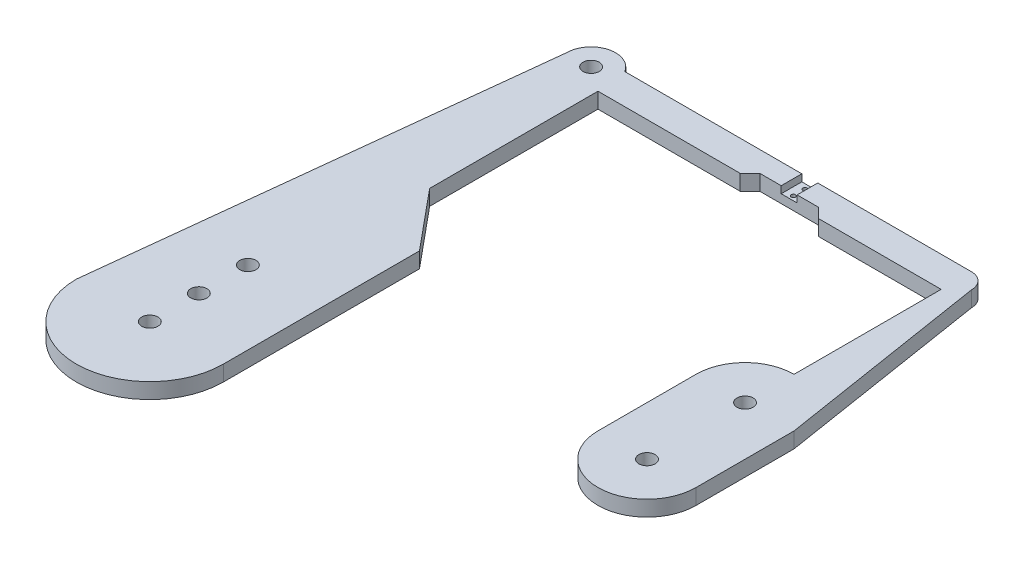
ISO-10303-21;
HEADER;
FILE_DESCRIPTION(('STEP AP214'),'2;1');
FILE_NAME('part.step','',(''),(''),'','','');
FILE_SCHEMA(('AUTOMOTIVE_DESIGN { 1 0 10303 214 1 1 1 1 }'));
ENDSEC;
DATA;
#1=APPLICATION_CONTEXT('core data for automotive mechanical design processes');
#2=APPLICATION_PROTOCOL_DEFINITION('international standard','automotive_design',2000,#1);
#3=PRODUCT_CONTEXT('',#1,'mechanical');
#4=PRODUCT('Part','Part','',(#3));
#5=PRODUCT_RELATED_PRODUCT_CATEGORY('part','',(#4));
#6=PRODUCT_DEFINITION_FORMATION('','',#4);
#7=PRODUCT_DEFINITION_CONTEXT('part definition',#1,'design');
#8=PRODUCT_DEFINITION('design','',#6,#7);
#9=PRODUCT_DEFINITION_SHAPE('','',#8);
#10=(LENGTH_UNIT() NAMED_UNIT(*) SI_UNIT(.MILLI.,.METRE.));
#11=(NAMED_UNIT(*) PLANE_ANGLE_UNIT() SI_UNIT($,.RADIAN.));
#12=(NAMED_UNIT(*) SI_UNIT($,.STERADIAN.) SOLID_ANGLE_UNIT());
#13=UNCERTAINTY_MEASURE_WITH_UNIT(LENGTH_MEASURE(1.E-05),#10,'distance_accuracy_value','');
#14=(GEOMETRIC_REPRESENTATION_CONTEXT(3) GLOBAL_UNCERTAINTY_ASSIGNED_CONTEXT((#13)) GLOBAL_UNIT_ASSIGNED_CONTEXT((#10,
#11,#12)) REPRESENTATION_CONTEXT('',''));
#15=CARTESIAN_POINT('',(0.,0.,0.));
#16=DIRECTION('',(0.,0.,1.));
#17=DIRECTION('',(1.,0.,0.));
#18=AXIS2_PLACEMENT_3D('',#15,#16,#17);
#19=CARTESIAN_POINT('',(0.,6.35,180.));
#20=DIRECTION('',(0.,1.,0.));
#21=DIRECTION('',(0.,0.,1.));
#22=AXIS2_PLACEMENT_3D('',#19,#20,#21);
#23=PLANE('',#22);
#24=DIRECTION('',(0.,0.,-1.));
#25=VECTOR('',#24,1.);
#26=CARTESIAN_POINT('',(87.25,6.35,4.88577018454193));
#27=LINE('',#26,#25);
#28=CARTESIAN_POINT('',(87.25,6.35,3.2));
#29=VERTEX_POINT('',#28);
#30=CARTESIAN_POINT('',(87.25,6.35,-5.21582572254541));
#31=VERTEX_POINT('',#30);
#32=EDGE_CURVE('E326',#29,#31,#27,.T.);
#33=ORIENTED_EDGE('',*,*,#32,.F.);
#34=DIRECTION('',(1.,0.,0.));
#35=VECTOR('',#34,1.);
#36=CARTESIAN_POINT('',(72.,6.35,3.2));
#37=LINE('',#36,#35);
#38=CARTESIAN_POINT('',(96.,6.35,3.2));
#39=VERTEX_POINT('',#38);
#40=EDGE_CURVE('E387',#29,#39,#37,.T.);
#41=ORIENTED_EDGE('',*,*,#40,.T.);
#42=DIRECTION('',(0.707106781186554,0.,0.707106781186541));
#43=VECTOR('',#42,1.);
#44=CARTESIAN_POINT('',(96.,6.35,3.2));
#45=LINE('',#44,#43);
#46=CARTESIAN_POINT('',(100.,6.35,7.2));
#47=VERTEX_POINT('',#46);
#48=EDGE_CURVE('E389',#39,#47,#45,.T.);
#49=ORIENTED_EDGE('',*,*,#48,.T.);
#50=DIRECTION('',(1.,0.,0.));
#51=VECTOR('',#50,1.);
#52=CARTESIAN_POINT('',(100.,6.35,7.2));
#53=LINE('',#52,#51);
#54=CARTESIAN_POINT('',(150.,6.35,7.2));
#55=VERTEX_POINT('',#54);
#56=EDGE_CURVE('E391',#47,#55,#53,.T.);
#57=ORIENTED_EDGE('',*,*,#56,.T.);
#58=DIRECTION('',(0.,0.,1.));
#59=VECTOR('',#58,1.);
#60=CARTESIAN_POINT('',(150.,6.35,7.2));
#61=LINE('',#60,#59);
#62=CARTESIAN_POINT('',(150.,6.35,67.2));
#63=VERTEX_POINT('',#62);
#64=EDGE_CURVE('E393',#55,#63,#61,.T.);
#65=ORIENTED_EDGE('',*,*,#64,.T.);
#66=CARTESIAN_POINT('',(150.,6.35,87.2));
#67=DIRECTION('',(0.,1.,0.));
#68=DIRECTION('',(0.,0.,1.));
#69=AXIS2_PLACEMENT_3D('',#66,#67,#68);
#70=CIRCLE('',#69,20.);
#71=CARTESIAN_POINT('',(130.,6.35,87.2000000000001));
#72=VERTEX_POINT('',#71);
#73=EDGE_CURVE('E395',#63,#72,#70,.T.);
#74=ORIENTED_EDGE('',*,*,#73,.T.);
#75=DIRECTION('',(0.,0.,1.));
#76=VECTOR('',#75,1.);
#77=CARTESIAN_POINT('',(130.,6.35,87.2000000000001));
#78=LINE('',#77,#76);
#79=CARTESIAN_POINT('',(130.,6.35,127.2));
#80=VERTEX_POINT('',#79);
#81=EDGE_CURVE('E397',#72,#80,#78,.T.);
#82=ORIENTED_EDGE('',*,*,#81,.T.);
#83=CARTESIAN_POINT('',(150.,6.35,127.2));
#84=DIRECTION('',(0.,1.,0.));
#85=DIRECTION('',(0.,0.,1.));
#86=AXIS2_PLACEMENT_3D('',#83,#84,#85);
#87=CIRCLE('',#86,20.);
#88=CARTESIAN_POINT('',(170.,6.35,127.2));
#89=VERTEX_POINT('',#88);
#90=EDGE_CURVE('E399',#80,#89,#87,.T.);
#91=ORIENTED_EDGE('',*,*,#90,.T.);
#92=DIRECTION('',(0.,0.,-1.));
#93=VECTOR('',#92,1.);
#94=CARTESIAN_POINT('',(170.,6.35,87.2));
#95=LINE('',#94,#93);
#96=CARTESIAN_POINT('',(170.,6.35,87.2));
#97=VERTEX_POINT('',#96);
#98=EDGE_CURVE('E401',#89,#97,#95,.T.);
#99=ORIENTED_EDGE('',*,*,#98,.T.);
#100=DIRECTION('',(-0.156700683439324,0.,-0.987646138963571));
#101=VECTOR('',#100,1.);
#102=CARTESIAN_POINT('',(156.343737357121,6.35,1.12791163457557));
#103=LINE('',#102,#101);
#104=CARTESIAN_POINT('',(156.343737357121,6.35,1.12791163457557));
#105=VERTEX_POINT('',#104);
#106=EDGE_CURVE('E403',#97,#105,#103,.T.);
#107=ORIENTED_EDGE('',*,*,#106,.T.);
#108=CARTESIAN_POINT('',(150.,6.35,1.12791163457557));
#109=DIRECTION('',(0.,1.,0.));
#110=DIRECTION('',(0.,0.,1.));
#111=AXIS2_PLACEMENT_3D('',#108,#109,#110);
#112=CIRCLE('',#111,6.34373735712099);
#113=CARTESIAN_POINT('',(150.,6.35,-5.21582572254542));
#114=VERTEX_POINT('',#113);
#115=EDGE_CURVE('E405',#105,#114,#112,.T.);
#116=ORIENTED_EDGE('',*,*,#115,.T.);
#117=DIRECTION('',(-1.,0.,0.));
#118=VECTOR('',#117,1.);
#119=CARTESIAN_POINT('',(75.,6.35,-5.21582572254541));
#120=LINE('',#119,#118);
#121=EDGE_CURVE('E407',#114,#31,#120,.T.);
#122=ORIENTED_EDGE('',*,*,#121,.T.);
#123=EDGE_LOOP('',(#33,#41,#49,#57,#65,#74,#82,#91,#99,#107,#116,#122));
#124=FACE_BOUND('',#123,.T.);
#125=CARTESIAN_POINT('',(150.,6.35,87.2));
#126=DIRECTION('',(0.,1.,0.));
#127=DIRECTION('',(0.,0.,1.));
#128=AXIS2_PLACEMENT_3D('',#125,#126,#127);
#129=CIRCLE('',#128,3.3);
#130=CARTESIAN_POINT('',(150.,6.35,90.5));
#131=VERTEX_POINT('',#130);
#132=EDGE_CURVE('E362',#131,#131,#129,.T.);
#133=ORIENTED_EDGE('',*,*,#132,.F.);
#134=EDGE_LOOP('',(#133));
#135=FACE_BOUND('',#134,.T.);
#136=CARTESIAN_POINT('',(150.,6.35,127.2));
#137=DIRECTION('',(0.,1.,0.));
#138=DIRECTION('',(0.,0.,1.));
#139=AXIS2_PLACEMENT_3D('',#136,#137,#138);
#140=CIRCLE('',#139,3.3);
#141=CARTESIAN_POINT('',(150.,6.35,130.5));
#142=VERTEX_POINT('',#141);
#143=EDGE_CURVE('E374',#142,#142,#140,.T.);
#144=ORIENTED_EDGE('',*,*,#143,.F.);
#145=EDGE_LOOP('',(#144));
#146=FACE_BOUND('',#145,.T.);
#147=ADVANCED_FACE('F33',(#124,#135,#146),#23,.T.);
#148=CARTESIAN_POINT('',(84.,6.35,1.50000000000001));
#149=DIRECTION('',(0.,-1.,0.));
#150=DIRECTION('',(0.,0.,-1.));
#151=AXIS2_PLACEMENT_3D('',#148,#149,#150);
#152=CYLINDRICAL_SURFACE('',#151,0.889000000000003);
#153=CARTESIAN_POINT('',(84.,0.,1.50000000000001));
#154=DIRECTION('',(0.,1.,0.));
#155=DIRECTION('',(0.,0.,1.));
#156=AXIS2_PLACEMENT_3D('',#153,#154,#155);
#157=CIRCLE('',#156,0.889000000000003);
#158=CARTESIAN_POINT('',(84.,0.,2.38900000000001));
#159=VERTEX_POINT('',#158);
#160=EDGE_CURVE('E358',#159,#159,#157,.T.);
#161=ORIENTED_EDGE('',*,*,#160,.F.);
#162=EDGE_LOOP('',(#161));
#163=FACE_BOUND('',#162,.T.);
#164=CARTESIAN_POINT('',(84.,3.5,1.50000000000001));
#165=DIRECTION('',(0.,1.,0.));
#166=DIRECTION('',(0.,0.,1.));
#167=AXIS2_PLACEMENT_3D('',#164,#165,#166);
#168=CIRCLE('',#167,0.889000000000003);
#169=CARTESIAN_POINT('',(84.,3.5,2.38900000000001));
#170=VERTEX_POINT('',#169);
#171=EDGE_CURVE('E299',#170,#170,#168,.T.);
#172=ORIENTED_EDGE('',*,*,#171,.T.);
#173=EDGE_LOOP('',(#172));
#174=FACE_BOUND('',#173,.T.);
#175=ADVANCED_FACE('F473',(#163,#174),#152,.F.);
#176=CARTESIAN_POINT('',(84.,6.35,-3.21599999999999));
#177=DIRECTION('',(0.,-1.,0.));
#178=DIRECTION('',(0.,0.,-1.));
#179=AXIS2_PLACEMENT_3D('',#176,#177,#178);
#180=CYLINDRICAL_SURFACE('',#179,0.889000000000003);
#181=CARTESIAN_POINT('',(84.,0.,-3.21599999999999));
#182=DIRECTION('',(0.,1.,0.));
#183=DIRECTION('',(0.,0.,1.));
#184=AXIS2_PLACEMENT_3D('',#181,#182,#183);
#185=CIRCLE('',#184,0.889000000000003);
#186=CARTESIAN_POINT('',(84.,0.,-2.32699999999999));
#187=VERTEX_POINT('',#186);
#188=EDGE_CURVE('E353',#187,#187,#185,.T.);
#189=ORIENTED_EDGE('',*,*,#188,.F.);
#190=EDGE_LOOP('',(#189));
#191=FACE_BOUND('',#190,.T.);
#192=CARTESIAN_POINT('',(84.,3.5,-3.21599999999999));
#193=DIRECTION('',(0.,1.,0.));
#194=DIRECTION('',(0.,0.,1.));
#195=AXIS2_PLACEMENT_3D('',#192,#193,#194);
#196=CIRCLE('',#195,0.889000000000003);
#197=CARTESIAN_POINT('',(84.,3.5,-2.32699999999999));
#198=VERTEX_POINT('',#197);
#199=EDGE_CURVE('E297',#198,#198,#196,.T.);
#200=ORIENTED_EDGE('',*,*,#199,.T.);
#201=EDGE_LOOP('',(#200));
#202=FACE_BOUND('',#201,.T.);
#203=ADVANCED_FACE('F478',(#191,#202),#180,.F.);
#204=DIRECTION('',(0.,0.,1.));
#205=VECTOR('',#204,1.);
#206=CARTESIAN_POINT('',(80.75,6.35,-5.83824904864392));
#207=LINE('',#206,#205);
#208=CARTESIAN_POINT('',(80.75,6.35,-5.21582572254541));
#209=VERTEX_POINT('',#208);
#210=CARTESIAN_POINT('',(80.75,6.35,3.2));
#211=VERTEX_POINT('',#210);
#212=EDGE_CURVE('E318',#209,#211,#207,.T.);
#213=ORIENTED_EDGE('',*,*,#212,.F.);
#214=CARTESIAN_POINT('',(8.53200808907456,6.35,-5.2158257225454));
#215=VERTEX_POINT('',#214);
#216=EDGE_CURVE('E310',#209,#215,#120,.T.);
#217=ORIENTED_EDGE('',*,*,#216,.T.);
#218=CARTESIAN_POINT('',(0.,6.35,0.));
#219=DIRECTION('',(0.,1.,0.));
#220=DIRECTION('',(0.,0.,1.));
#221=AXIS2_PLACEMENT_3D('',#218,#219,#220);
#222=CIRCLE('',#221,10.);
#223=CARTESIAN_POINT('',(-10.,6.35,0.));
#224=VERTEX_POINT('',#223);
#225=EDGE_CURVE('E410',#215,#224,#222,.T.);
#226=ORIENTED_EDGE('',*,*,#225,.T.);
#227=DIRECTION('',(-0.110431526074846,0.,0.993883734673619));
#228=VECTOR('',#227,1.);
#229=CARTESIAN_POINT('',(-10.,6.35,0.));
#230=LINE('',#229,#228);
#231=CARTESIAN_POINT('',(-30.,6.35,180.));
#232=VERTEX_POINT('',#231);
#233=EDGE_CURVE('E412',#224,#232,#230,.T.);
#234=ORIENTED_EDGE('',*,*,#233,.T.);
#235=CARTESIAN_POINT('',(0.,6.35,180.));
#236=DIRECTION('',(0.,1.,0.));
#237=DIRECTION('',(0.,0.,1.));
#238=AXIS2_PLACEMENT_3D('',#235,#236,#237);
#239=CIRCLE('',#238,30.);
#240=CARTESIAN_POINT('',(30.,6.35,180.));
#241=VERTEX_POINT('',#240);
#242=EDGE_CURVE('E187',#232,#241,#239,.T.);
#243=ORIENTED_EDGE('',*,*,#242,.T.);
#244=DIRECTION('',(0.,0.,-1.));
#245=VECTOR('',#244,1.);
#246=CARTESIAN_POINT('',(30.,6.35,180.));
#247=LINE('',#246,#245);
#248=CARTESIAN_POINT('',(30.,6.35,100.));
#249=VERTEX_POINT('',#248);
#250=EDGE_CURVE('E178',#241,#249,#247,.T.);
#251=ORIENTED_EDGE('',*,*,#250,.T.);
#252=DIRECTION('',(-0.637951972751051,0.,-0.770076152379128));
#253=VECTOR('',#252,1.);
#254=CARTESIAN_POINT('',(30.,6.35,100.));
#255=LINE('',#254,#253);
#256=CARTESIAN_POINT('',(10.,6.35,75.857864376269));
#257=VERTEX_POINT('',#256);
#258=EDGE_CURVE('E184',#249,#257,#255,.T.);
#259=ORIENTED_EDGE('',*,*,#258,.T.);
#260=DIRECTION('',(0.,0.,-1.));
#261=VECTOR('',#260,1.);
#262=CARTESIAN_POINT('',(10.,6.35,7.2));
#263=LINE('',#262,#261);
#264=CARTESIAN_POINT('',(10.,6.35,7.2));
#265=VERTEX_POINT('',#264);
#266=EDGE_CURVE('E57',#257,#265,#263,.T.);
#267=ORIENTED_EDGE('',*,*,#266,.T.);
#268=DIRECTION('',(1.,0.,0.));
#269=VECTOR('',#268,1.);
#270=CARTESIAN_POINT('',(59.,6.35,7.2));
#271=LINE('',#270,#269);
#272=CARTESIAN_POINT('',(68.0000000000001,6.35,7.2));
#273=VERTEX_POINT('',#272);
#274=EDGE_CURVE('E129',#265,#273,#271,.T.);
#275=ORIENTED_EDGE('',*,*,#274,.T.);
#276=DIRECTION('',(0.707106781186541,0.,-0.707106781186554));
#277=VECTOR('',#276,1.);
#278=CARTESIAN_POINT('',(72.,6.35,3.2));
#279=LINE('',#278,#277);
#280=CARTESIAN_POINT('',(72.,6.35,3.2));
#281=VERTEX_POINT('',#280);
#282=EDGE_CURVE('E385',#273,#281,#279,.T.);
#283=ORIENTED_EDGE('',*,*,#282,.T.);
#284=EDGE_CURVE('E325',#281,#211,#37,.T.);
#285=ORIENTED_EDGE('',*,*,#284,.T.);
#286=EDGE_LOOP('',(#213,#217,#226,#234,#243,#251,#259,#267,#275,#283,#285));
#287=FACE_BOUND('',#286,.T.);
#288=CARTESIAN_POINT('',(0.,6.35,160.));
#289=DIRECTION('',(0.,1.,0.));
#290=DIRECTION('',(0.,0.,1.));
#291=AXIS2_PLACEMENT_3D('',#288,#289,#290);
#292=CIRCLE('',#291,3.3);
#293=CARTESIAN_POINT('',(0.,6.35,163.3));
#294=VERTEX_POINT('',#293);
#295=EDGE_CURVE('E350',#294,#294,#292,.T.);
#296=ORIENTED_EDGE('',*,*,#295,.F.);
#297=EDGE_LOOP('',(#296));
#298=FACE_BOUND('',#297,.T.);
#299=CARTESIAN_POINT('',(0.,6.35,180.));
#300=DIRECTION('',(0.,1.,0.));
#301=DIRECTION('',(0.,0.,1.));
#302=AXIS2_PLACEMENT_3D('',#299,#300,#301);
#303=CIRCLE('',#302,3.3);
#304=CARTESIAN_POINT('',(0.,6.35,183.3));
#305=VERTEX_POINT('',#304);
#306=EDGE_CURVE('E368',#305,#305,#303,.T.);
#307=ORIENTED_EDGE('',*,*,#306,.F.);
#308=EDGE_LOOP('',(#307));
#309=FACE_BOUND('',#308,.T.);
#310=CARTESIAN_POINT('',(0.,6.35,0.));
#311=DIRECTION('',(0.,1.,0.));
#312=DIRECTION('',(0.,0.,1.));
#313=AXIS2_PLACEMENT_3D('',#310,#311,#312);
#314=CIRCLE('',#313,3.3);
#315=CARTESIAN_POINT('',(0.,6.35,3.3));
#316=VERTEX_POINT('',#315);
#317=EDGE_CURVE('E211',#316,#316,#314,.T.);
#318=ORIENTED_EDGE('',*,*,#317,.F.);
#319=EDGE_LOOP('',(#318));
#320=FACE_BOUND('',#319,.T.);
#321=CARTESIAN_POINT('',(0.,6.35,140.));
#322=DIRECTION('',(0.,1.,0.));
#323=DIRECTION('',(0.,0.,1.));
#324=AXIS2_PLACEMENT_3D('',#321,#322,#323);
#325=CIRCLE('',#324,3.3);
#326=CARTESIAN_POINT('',(0.,6.35,143.3));
#327=VERTEX_POINT('',#326);
#328=EDGE_CURVE('E344',#327,#327,#325,.T.);
#329=ORIENTED_EDGE('',*,*,#328,.F.);
#330=EDGE_LOOP('',(#329));
#331=FACE_BOUND('',#330,.T.);
#332=ADVANCED_FACE('F181',(#287,#298,#309,#320,#331),#23,.T.);
#333=CARTESIAN_POINT('',(0.,0.,180.));
#334=DIRECTION('',(0.,1.,0.));
#335=DIRECTION('',(0.,0.,1.));
#336=AXIS2_PLACEMENT_3D('',#333,#334,#335);
#337=PLANE('',#336);
#338=DIRECTION('',(1.,0.,0.));
#339=VECTOR('',#338,1.);
#340=CARTESIAN_POINT('',(68.0000000000001,0.,7.2));
#341=LINE('',#340,#339);
#342=CARTESIAN_POINT('',(10.,0.,7.2));
#343=VERTEX_POINT('',#342);
#344=CARTESIAN_POINT('',(68.0000000000001,0.,7.2));
#345=VERTEX_POINT('',#344);
#346=EDGE_CURVE('E123',#343,#345,#341,.T.);
#347=ORIENTED_EDGE('',*,*,#346,.F.);
#348=DIRECTION('',(0.,0.,-1.));
#349=VECTOR('',#348,1.);
#350=CARTESIAN_POINT('',(10.,0.,7.2));
#351=LINE('',#350,#349);
#352=CARTESIAN_POINT('',(10.,0.,75.857864376269));
#353=VERTEX_POINT('',#352);
#354=EDGE_CURVE('E246',#353,#343,#351,.T.);
#355=ORIENTED_EDGE('',*,*,#354,.F.);
#356=DIRECTION('',(-0.637951972751051,0.,-0.770076152379128));
#357=VECTOR('',#356,1.);
#358=CARTESIAN_POINT('',(30.,0.,100.));
#359=LINE('',#358,#357);
#360=CARTESIAN_POINT('',(30.,0.,100.));
#361=VERTEX_POINT('',#360);
#362=EDGE_CURVE('E244',#361,#353,#359,.T.);
#363=ORIENTED_EDGE('',*,*,#362,.F.);
#364=DIRECTION('',(0.,0.,-1.));
#365=VECTOR('',#364,1.);
#366=CARTESIAN_POINT('',(30.,0.,180.));
#367=LINE('',#366,#365);
#368=CARTESIAN_POINT('',(30.,0.,180.));
#369=VERTEX_POINT('',#368);
#370=EDGE_CURVE('E196',#369,#361,#367,.T.);
#371=ORIENTED_EDGE('',*,*,#370,.F.);
#372=CARTESIAN_POINT('',(0.,0.,180.));
#373=DIRECTION('',(0.,1.,0.));
#374=DIRECTION('',(0.,0.,1.));
#375=AXIS2_PLACEMENT_3D('',#372,#373,#374);
#376=CIRCLE('',#375,30.);
#377=CARTESIAN_POINT('',(-30.,0.,180.));
#378=VERTEX_POINT('',#377);
#379=EDGE_CURVE('E241',#378,#369,#376,.T.);
#380=ORIENTED_EDGE('',*,*,#379,.F.);
#381=DIRECTION('',(-0.110431526074846,0.,0.993883734673619));
#382=VECTOR('',#381,1.);
#383=CARTESIAN_POINT('',(-10.,0.,0.));
#384=LINE('',#383,#382);
#385=CARTESIAN_POINT('',(-10.,0.,0.));
#386=VERTEX_POINT('',#385);
#387=EDGE_CURVE('E239',#386,#378,#384,.T.);
#388=ORIENTED_EDGE('',*,*,#387,.F.);
#389=CARTESIAN_POINT('',(0.,0.,0.));
#390=DIRECTION('',(0.,1.,0.));
#391=DIRECTION('',(0.,0.,1.));
#392=AXIS2_PLACEMENT_3D('',#389,#390,#391);
#393=CIRCLE('',#392,10.);
#394=CARTESIAN_POINT('',(8.53200808907456,0.,-5.2158257225454));
#395=VERTEX_POINT('',#394);
#396=EDGE_CURVE('E237',#395,#386,#393,.T.);
#397=ORIENTED_EDGE('',*,*,#396,.F.);
#398=DIRECTION('',(-1.,0.,0.));
#399=VECTOR('',#398,1.);
#400=CARTESIAN_POINT('',(75.,0.,-5.21582572254541));
#401=LINE('',#400,#399);
#402=CARTESIAN_POINT('',(150.,0.,-5.21582572254542));
#403=VERTEX_POINT('',#402);
#404=EDGE_CURVE('E235',#403,#395,#401,.T.);
#405=ORIENTED_EDGE('',*,*,#404,.F.);
#406=CARTESIAN_POINT('',(150.,0.,1.12791163457557));
#407=DIRECTION('',(0.,1.,0.));
#408=DIRECTION('',(0.,0.,1.));
#409=AXIS2_PLACEMENT_3D('',#406,#407,#408);
#410=CIRCLE('',#409,6.34373735712099);
#411=CARTESIAN_POINT('',(156.343737357121,0.,1.12791163457557));
#412=VERTEX_POINT('',#411);
#413=EDGE_CURVE('E232',#412,#403,#410,.T.);
#414=ORIENTED_EDGE('',*,*,#413,.F.);
#415=DIRECTION('',(-0.156700683439324,0.,-0.987646138963571));
#416=VECTOR('',#415,1.);
#417=CARTESIAN_POINT('',(156.343737357121,0.,1.12791163457557));
#418=LINE('',#417,#416);
#419=CARTESIAN_POINT('',(170.,0.,87.2));
#420=VERTEX_POINT('',#419);
#421=EDGE_CURVE('E230',#420,#412,#418,.T.);
#422=ORIENTED_EDGE('',*,*,#421,.F.);
#423=DIRECTION('',(0.,0.,-1.));
#424=VECTOR('',#423,1.);
#425=CARTESIAN_POINT('',(170.,0.,87.2));
#426=LINE('',#425,#424);
#427=CARTESIAN_POINT('',(170.,0.,127.2));
#428=VERTEX_POINT('',#427);
#429=EDGE_CURVE('E228',#428,#420,#426,.T.);
#430=ORIENTED_EDGE('',*,*,#429,.F.);
#431=CARTESIAN_POINT('',(150.,0.,127.2));
#432=DIRECTION('',(0.,1.,0.));
#433=DIRECTION('',(0.,0.,1.));
#434=AXIS2_PLACEMENT_3D('',#431,#432,#433);
#435=CIRCLE('',#434,20.);
#436=CARTESIAN_POINT('',(130.,0.,127.2));
#437=VERTEX_POINT('',#436);
#438=EDGE_CURVE('E226',#437,#428,#435,.T.);
#439=ORIENTED_EDGE('',*,*,#438,.F.);
#440=DIRECTION('',(0.,0.,1.));
#441=VECTOR('',#440,1.);
#442=CARTESIAN_POINT('',(130.,0.,87.2000000000001));
#443=LINE('',#442,#441);
#444=CARTESIAN_POINT('',(130.,0.,87.2000000000001));
#445=VERTEX_POINT('',#444);
#446=EDGE_CURVE('E224',#445,#437,#443,.T.);
#447=ORIENTED_EDGE('',*,*,#446,.F.);
#448=CARTESIAN_POINT('',(150.,0.,87.2));
#449=DIRECTION('',(0.,1.,0.));
#450=DIRECTION('',(0.,0.,1.));
#451=AXIS2_PLACEMENT_3D('',#448,#449,#450);
#452=CIRCLE('',#451,20.);
#453=CARTESIAN_POINT('',(150.,0.,67.2));
#454=VERTEX_POINT('',#453);
#455=EDGE_CURVE('E222',#454,#445,#452,.T.);
#456=ORIENTED_EDGE('',*,*,#455,.F.);
#457=DIRECTION('',(0.,0.,1.));
#458=VECTOR('',#457,1.);
#459=CARTESIAN_POINT('',(150.,0.,7.2));
#460=LINE('',#459,#458);
#461=CARTESIAN_POINT('',(150.,0.,7.2));
#462=VERTEX_POINT('',#461);
#463=EDGE_CURVE('E220',#462,#454,#460,.T.);
#464=ORIENTED_EDGE('',*,*,#463,.F.);
#465=DIRECTION('',(1.,0.,0.));
#466=VECTOR('',#465,1.);
#467=CARTESIAN_POINT('',(100.,0.,7.2));
#468=LINE('',#467,#466);
#469=CARTESIAN_POINT('',(100.,0.,7.2));
#470=VERTEX_POINT('',#469);
#471=EDGE_CURVE('E218',#470,#462,#468,.T.);
#472=ORIENTED_EDGE('',*,*,#471,.F.);
#473=DIRECTION('',(0.707106781186554,0.,0.707106781186541));
#474=VECTOR('',#473,1.);
#475=CARTESIAN_POINT('',(96.,0.,3.2));
#476=LINE('',#475,#474);
#477=CARTESIAN_POINT('',(96.,0.,3.2));
#478=VERTEX_POINT('',#477);
#479=EDGE_CURVE('E216',#478,#470,#476,.T.);
#480=ORIENTED_EDGE('',*,*,#479,.F.);
#481=DIRECTION('',(1.,0.,0.));
#482=VECTOR('',#481,1.);
#483=CARTESIAN_POINT('',(84.,0.,3.2));
#484=LINE('',#483,#482);
#485=CARTESIAN_POINT('',(72.,0.,3.2));
#486=VERTEX_POINT('',#485);
#487=EDGE_CURVE('E214',#486,#478,#484,.T.);
#488=ORIENTED_EDGE('',*,*,#487,.F.);
#489=DIRECTION('',(0.707106781186541,0.,-0.707106781186554));
#490=VECTOR('',#489,1.);
#491=CARTESIAN_POINT('',(72.,0.,3.2));
#492=LINE('',#491,#490);
#493=EDGE_CURVE('E210',#345,#486,#492,.T.);
#494=ORIENTED_EDGE('',*,*,#493,.F.);
#495=EDGE_LOOP('',(#347,#355,#363,#371,#380,#388,#397,#405,#414,#422,#430,#439,#447,#456,#464,
#472,#480,#488,#494));
#496=FACE_BOUND('',#495,.T.);
#497=CARTESIAN_POINT('',(0.,0.,0.));
#498=DIRECTION('',(0.,1.,0.));
#499=DIRECTION('',(0.,0.,1.));
#500=AXIS2_PLACEMENT_3D('',#497,#498,#499);
#501=CIRCLE('',#500,3.3);
#502=CARTESIAN_POINT('',(0.,0.,3.3));
#503=VERTEX_POINT('',#502);
#504=EDGE_CURVE('E377',#503,#503,#501,.T.);
#505=ORIENTED_EDGE('',*,*,#504,.T.);
#506=EDGE_LOOP('',(#505));
#507=FACE_BOUND('',#506,.T.);
#508=CARTESIAN_POINT('',(150.,0.,127.2));
#509=DIRECTION('',(0.,1.,0.));
#510=DIRECTION('',(0.,0.,1.));
#511=AXIS2_PLACEMENT_3D('',#508,#509,#510);
#512=CIRCLE('',#511,3.3);
#513=CARTESIAN_POINT('',(150.,0.,130.5));
#514=VERTEX_POINT('',#513);
#515=EDGE_CURVE('E371',#514,#514,#512,.T.);
#516=ORIENTED_EDGE('',*,*,#515,.T.);
#517=EDGE_LOOP('',(#516));
#518=FACE_BOUND('',#517,.T.);
#519=CARTESIAN_POINT('',(0.,0.,180.));
#520=DIRECTION('',(0.,1.,0.));
#521=DIRECTION('',(0.,0.,1.));
#522=AXIS2_PLACEMENT_3D('',#519,#520,#521);
#523=CIRCLE('',#522,3.3);
#524=CARTESIAN_POINT('',(0.,0.,183.3));
#525=VERTEX_POINT('',#524);
#526=EDGE_CURVE('E365',#525,#525,#523,.T.);
#527=ORIENTED_EDGE('',*,*,#526,.T.);
#528=EDGE_LOOP('',(#527));
#529=FACE_BOUND('',#528,.T.);
#530=CARTESIAN_POINT('',(150.,0.,87.2));
#531=DIRECTION('',(0.,1.,0.));
#532=DIRECTION('',(0.,0.,1.));
#533=AXIS2_PLACEMENT_3D('',#530,#531,#532);
#534=CIRCLE('',#533,3.3);
#535=CARTESIAN_POINT('',(150.,0.,90.5));
#536=VERTEX_POINT('',#535);
#537=EDGE_CURVE('E361',#536,#536,#534,.T.);
#538=ORIENTED_EDGE('',*,*,#537,.T.);
#539=EDGE_LOOP('',(#538));
#540=FACE_BOUND('',#539,.T.);
#541=ORIENTED_EDGE('',*,*,#160,.T.);
#542=EDGE_LOOP('',(#541));
#543=FACE_BOUND('',#542,.T.);
#544=ORIENTED_EDGE('',*,*,#188,.T.);
#545=EDGE_LOOP('',(#544));
#546=FACE_BOUND('',#545,.T.);
#547=CARTESIAN_POINT('',(0.,0.,160.));
#548=DIRECTION('',(0.,1.,0.));
#549=DIRECTION('',(0.,0.,1.));
#550=AXIS2_PLACEMENT_3D('',#547,#548,#549);
#551=CIRCLE('',#550,3.3);
#552=CARTESIAN_POINT('',(0.,0.,163.3));
#553=VERTEX_POINT('',#552);
#554=EDGE_CURVE('E347',#553,#553,#551,.T.);
#555=ORIENTED_EDGE('',*,*,#554,.T.);
#556=EDGE_LOOP('',(#555));
#557=FACE_BOUND('',#556,.T.);
#558=CARTESIAN_POINT('',(0.,0.,140.));
#559=DIRECTION('',(0.,1.,0.));
#560=DIRECTION('',(0.,0.,1.));
#561=AXIS2_PLACEMENT_3D('',#558,#559,#560);
#562=CIRCLE('',#561,3.3);
#563=CARTESIAN_POINT('',(0.,0.,143.3));
#564=VERTEX_POINT('',#563);
#565=EDGE_CURVE('E343',#564,#564,#562,.T.);
#566=ORIENTED_EDGE('',*,*,#565,.T.);
#567=EDGE_LOOP('',(#566));
#568=FACE_BOUND('',#567,.T.);
#569=ADVANCED_FACE('F423',(#496,#507,#518,#529,#540,#543,#546,#557,#568),#337,.F.);
#570=CARTESIAN_POINT('',(68.0000000000001,6.35,7.2));
#571=DIRECTION('',(0.,0.,-1.));
#572=DIRECTION('',(-1.,0.,0.));
#573=AXIS2_PLACEMENT_3D('',#570,#571,#572);
#574=PLANE('',#573);
#575=ORIENTED_EDGE('',*,*,#346,.T.);
#576=DIRECTION('',(0.,-1.,0.));
#577=VECTOR('',#576,1.);
#578=CARTESIAN_POINT('',(68.0000000000001,6.35,7.2));
#579=LINE('',#578,#577);
#580=EDGE_CURVE('E294',#273,#345,#579,.T.);
#581=ORIENTED_EDGE('',*,*,#580,.F.);
#582=ORIENTED_EDGE('',*,*,#274,.F.);
#583=DIRECTION('',(0.,-1.,0.));
#584=VECTOR('',#583,1.);
#585=CARTESIAN_POINT('',(10.,6.35,7.2));
#586=LINE('',#585,#584);
#587=EDGE_CURVE('E205',#265,#343,#586,.T.);
#588=ORIENTED_EDGE('',*,*,#587,.T.);
#589=EDGE_LOOP('',(#575,#581,#582,#588));
#590=FACE_BOUND('',#589,.T.);
#591=ADVANCED_FACE('F35',(#590),#574,.F.);
#592=CARTESIAN_POINT('',(72.,6.35,3.2));
#593=DIRECTION('',(-0.707106781186554,0.,-0.707106781186541));
#594=DIRECTION('',(-0.707106781186541,0.,0.707106781186554));
#595=AXIS2_PLACEMENT_3D('',#592,#593,#594);
#596=PLANE('',#595);
#597=ORIENTED_EDGE('',*,*,#493,.T.);
#598=DIRECTION('',(0.,-1.,0.));
#599=VECTOR('',#598,1.);
#600=CARTESIAN_POINT('',(72.,6.35,3.2));
#601=LINE('',#600,#599);
#602=EDGE_CURVE('E291',#281,#486,#601,.T.);
#603=ORIENTED_EDGE('',*,*,#602,.F.);
#604=ORIENTED_EDGE('',*,*,#282,.F.);
#605=ORIENTED_EDGE('',*,*,#580,.T.);
#606=EDGE_LOOP('',(#597,#603,#604,#605));
#607=FACE_BOUND('',#606,.T.);
#608=ADVANCED_FACE('F431',(#607),#596,.F.);
#609=CARTESIAN_POINT('',(84.,6.35,3.2));
#610=DIRECTION('',(0.,0.,-1.));
#611=DIRECTION('',(-1.,0.,0.));
#612=AXIS2_PLACEMENT_3D('',#609,#610,#611);
#613=PLANE('',#612);
#614=ORIENTED_EDGE('',*,*,#40,.F.);
#615=DIRECTION('',(0.,-1.,0.));
#616=VECTOR('',#615,1.);
#617=CARTESIAN_POINT('',(87.25,6.35,3.2));
#618=LINE('',#617,#616);
#619=CARTESIAN_POINT('',(87.25,3.5,3.2));
#620=VERTEX_POINT('',#619);
#621=EDGE_CURVE('E340',#29,#620,#618,.T.);
#622=ORIENTED_EDGE('',*,*,#621,.T.);
#623=DIRECTION('',(1.,0.,0.));
#624=VECTOR('',#623,1.);
#625=CARTESIAN_POINT('',(84.,3.5,3.2));
#626=LINE('',#625,#624);
#627=CARTESIAN_POINT('',(80.75,3.5,3.2));
#628=VERTEX_POINT('',#627);
#629=EDGE_CURVE('E336',#628,#620,#626,.T.);
#630=ORIENTED_EDGE('',*,*,#629,.F.);
#631=DIRECTION('',(0.,1.,0.));
#632=VECTOR('',#631,1.);
#633=CARTESIAN_POINT('',(80.75,6.35,3.2));
#634=LINE('',#633,#632);
#635=EDGE_CURVE('E338',#628,#211,#634,.T.);
#636=ORIENTED_EDGE('',*,*,#635,.T.);
#637=ORIENTED_EDGE('',*,*,#284,.F.);
#638=ORIENTED_EDGE('',*,*,#602,.T.);
#639=ORIENTED_EDGE('',*,*,#487,.T.);
#640=DIRECTION('',(0.,-1.,0.));
#641=VECTOR('',#640,1.);
#642=CARTESIAN_POINT('',(96.,6.35,3.2));
#643=LINE('',#642,#641);
#644=EDGE_CURVE('E288',#39,#478,#643,.T.);
#645=ORIENTED_EDGE('',*,*,#644,.F.);
#646=EDGE_LOOP('',(#614,#622,#630,#636,#637,#638,#639,#645));
#647=FACE_BOUND('',#646,.T.);
#648=ADVANCED_FACE('F434',(#647),#613,.F.);
#649=CARTESIAN_POINT('',(96.,6.35,3.2));
#650=DIRECTION('',(0.707106781186541,0.,-0.707106781186554));
#651=DIRECTION('',(-0.707106781186554,0.,-0.707106781186541));
#652=AXIS2_PLACEMENT_3D('',#649,#650,#651);
#653=PLANE('',#652);
#654=ORIENTED_EDGE('',*,*,#479,.T.);
#655=DIRECTION('',(0.,-1.,0.));
#656=VECTOR('',#655,1.);
#657=CARTESIAN_POINT('',(100.,6.35,7.2));
#658=LINE('',#657,#656);
#659=EDGE_CURVE('E285',#47,#470,#658,.T.);
#660=ORIENTED_EDGE('',*,*,#659,.F.);
#661=ORIENTED_EDGE('',*,*,#48,.F.);
#662=ORIENTED_EDGE('',*,*,#644,.T.);
#663=EDGE_LOOP('',(#654,#660,#661,#662));
#664=FACE_BOUND('',#663,.T.);
#665=ADVANCED_FACE('F579',(#664),#653,.F.);
#666=CARTESIAN_POINT('',(100.,6.35,7.2));
#667=DIRECTION('',(0.,0.,-1.));
#668=DIRECTION('',(-1.,0.,0.));
#669=AXIS2_PLACEMENT_3D('',#666,#667,#668);
#670=PLANE('',#669);
#671=ORIENTED_EDGE('',*,*,#471,.T.);
#672=DIRECTION('',(0.,-1.,0.));
#673=VECTOR('',#672,1.);
#674=CARTESIAN_POINT('',(150.,6.35,7.2));
#675=LINE('',#674,#673);
#676=EDGE_CURVE('E282',#55,#462,#675,.T.);
#677=ORIENTED_EDGE('',*,*,#676,.F.);
#678=ORIENTED_EDGE('',*,*,#56,.F.);
#679=ORIENTED_EDGE('',*,*,#659,.T.);
#680=EDGE_LOOP('',(#671,#677,#678,#679));
#681=FACE_BOUND('',#680,.T.);
#682=ADVANCED_FACE('F740',(#681),#670,.F.);
#683=CARTESIAN_POINT('',(150.,6.35,7.2));
#684=DIRECTION('',(1.,0.,0.));
#685=DIRECTION('',(0.,0.,-1.));
#686=AXIS2_PLACEMENT_3D('',#683,#684,#685);
#687=PLANE('',#686);
#688=ORIENTED_EDGE('',*,*,#463,.T.);
#689=DIRECTION('',(0.,-1.,0.));
#690=VECTOR('',#689,1.);
#691=CARTESIAN_POINT('',(150.,6.35,67.2));
#692=LINE('',#691,#690);
#693=EDGE_CURVE('E279',#63,#454,#692,.T.);
#694=ORIENTED_EDGE('',*,*,#693,.F.);
#695=ORIENTED_EDGE('',*,*,#64,.F.);
#696=ORIENTED_EDGE('',*,*,#676,.T.);
#697=EDGE_LOOP('',(#688,#694,#695,#696));
#698=FACE_BOUND('',#697,.T.);
#699=ADVANCED_FACE('F730',(#698),#687,.F.);
#700=CARTESIAN_POINT('',(150.,6.35,87.2));
#701=DIRECTION('',(0.,-1.,0.));
#702=DIRECTION('',(0.,0.,-1.));
#703=AXIS2_PLACEMENT_3D('',#700,#701,#702);
#704=CYLINDRICAL_SURFACE('',#703,20.);
#705=ORIENTED_EDGE('',*,*,#455,.T.);
#706=DIRECTION('',(0.,-1.,0.));
#707=VECTOR('',#706,1.);
#708=CARTESIAN_POINT('',(130.,6.35,87.2000000000001));
#709=LINE('',#708,#707);
#710=EDGE_CURVE('E276',#72,#445,#709,.T.);
#711=ORIENTED_EDGE('',*,*,#710,.F.);
#712=ORIENTED_EDGE('',*,*,#73,.F.);
#713=ORIENTED_EDGE('',*,*,#693,.T.);
#714=EDGE_LOOP('',(#705,#711,#712,#713));
#715=FACE_BOUND('',#714,.T.);
#716=ADVANCED_FACE('F720',(#715),#704,.T.);
#717=CARTESIAN_POINT('',(130.,6.35,87.2000000000001));
#718=DIRECTION('',(1.,0.,0.));
#719=DIRECTION('',(0.,0.,-1.));
#720=AXIS2_PLACEMENT_3D('',#717,#718,#719);
#721=PLANE('',#720);
#722=ORIENTED_EDGE('',*,*,#446,.T.);
#723=DIRECTION('',(0.,-1.,0.));
#724=VECTOR('',#723,1.);
#725=CARTESIAN_POINT('',(130.,6.35,127.2));
#726=LINE('',#725,#724);
#727=EDGE_CURVE('E273',#80,#437,#726,.T.);
#728=ORIENTED_EDGE('',*,*,#727,.F.);
#729=ORIENTED_EDGE('',*,*,#81,.F.);
#730=ORIENTED_EDGE('',*,*,#710,.T.);
#731=EDGE_LOOP('',(#722,#728,#729,#730));
#732=FACE_BOUND('',#731,.T.);
#733=ADVANCED_FACE('F710',(#732),#721,.F.);
#734=CARTESIAN_POINT('',(150.,6.35,127.2));
#735=DIRECTION('',(0.,-1.,0.));
#736=DIRECTION('',(0.,0.,-1.));
#737=AXIS2_PLACEMENT_3D('',#734,#735,#736);
#738=CYLINDRICAL_SURFACE('',#737,20.);
#739=ORIENTED_EDGE('',*,*,#438,.T.);
#740=DIRECTION('',(0.,-1.,0.));
#741=VECTOR('',#740,1.);
#742=CARTESIAN_POINT('',(170.,6.35,127.2));
#743=LINE('',#742,#741);
#744=EDGE_CURVE('E270',#89,#428,#743,.T.);
#745=ORIENTED_EDGE('',*,*,#744,.F.);
#746=ORIENTED_EDGE('',*,*,#90,.F.);
#747=ORIENTED_EDGE('',*,*,#727,.T.);
#748=EDGE_LOOP('',(#739,#745,#746,#747));
#749=FACE_BOUND('',#748,.T.);
#750=ADVANCED_FACE('F700',(#749),#738,.T.);
#751=CARTESIAN_POINT('',(170.,6.35,87.2));
#752=DIRECTION('',(-1.,0.,0.));
#753=DIRECTION('',(0.,0.,1.));
#754=AXIS2_PLACEMENT_3D('',#751,#752,#753);
#755=PLANE('',#754);
#756=ORIENTED_EDGE('',*,*,#429,.T.);
#757=DIRECTION('',(0.,-1.,0.));
#758=VECTOR('',#757,1.);
#759=CARTESIAN_POINT('',(170.,6.35,87.2));
#760=LINE('',#759,#758);
#761=EDGE_CURVE('E267',#97,#420,#760,.T.);
#762=ORIENTED_EDGE('',*,*,#761,.F.);
#763=ORIENTED_EDGE('',*,*,#98,.F.);
#764=ORIENTED_EDGE('',*,*,#744,.T.);
#765=EDGE_LOOP('',(#756,#762,#763,#764));
#766=FACE_BOUND('',#765,.T.);
#767=ADVANCED_FACE('F690',(#766),#755,.F.);
#768=CARTESIAN_POINT('',(156.343737357121,6.35,1.12791163457557));
#769=DIRECTION('',(-0.987646138963571,0.,0.156700683439324));
#770=DIRECTION('',(0.156700683439324,0.,0.987646138963571));
#771=AXIS2_PLACEMENT_3D('',#768,#769,#770);
#772=PLANE('',#771);
#773=ORIENTED_EDGE('',*,*,#421,.T.);
#774=DIRECTION('',(0.,-1.,0.));
#775=VECTOR('',#774,1.);
#776=CARTESIAN_POINT('',(156.343737357121,6.35,1.12791163457557));
#777=LINE('',#776,#775);
#778=EDGE_CURVE('E264',#105,#412,#777,.T.);
#779=ORIENTED_EDGE('',*,*,#778,.F.);
#780=ORIENTED_EDGE('',*,*,#106,.F.);
#781=ORIENTED_EDGE('',*,*,#761,.T.);
#782=EDGE_LOOP('',(#773,#779,#780,#781));
#783=FACE_BOUND('',#782,.T.);
#784=ADVANCED_FACE('F681',(#783),#772,.F.);
#785=CARTESIAN_POINT('',(150.,6.35,1.12791163457557));
#786=DIRECTION('',(0.,-1.,0.));
#787=DIRECTION('',(0.,0.,-1.));
#788=AXIS2_PLACEMENT_3D('',#785,#786,#787);
#789=CYLINDRICAL_SURFACE('',#788,6.34373735712099);
#790=ORIENTED_EDGE('',*,*,#413,.T.);
#791=DIRECTION('',(0.,-1.,0.));
#792=VECTOR('',#791,1.);
#793=CARTESIAN_POINT('',(150.,6.35,-5.21582572254542));
#794=LINE('',#793,#792);
#795=EDGE_CURVE('E261',#114,#403,#794,.T.);
#796=ORIENTED_EDGE('',*,*,#795,.F.);
#797=ORIENTED_EDGE('',*,*,#115,.F.);
#798=ORIENTED_EDGE('',*,*,#778,.T.);
#799=EDGE_LOOP('',(#790,#796,#797,#798));
#800=FACE_BOUND('',#799,.T.);
#801=ADVANCED_FACE('F456',(#800),#789,.T.);
#802=CARTESIAN_POINT('',(75.,6.35,-5.21582572254541));
#803=DIRECTION('',(0.,0.,1.));
#804=DIRECTION('',(1.,0.,0.));
#805=AXIS2_PLACEMENT_3D('',#802,#803,#804);
#806=PLANE('',#805);
#807=DIRECTION('',(-1.,0.,0.));
#808=VECTOR('',#807,1.);
#809=CARTESIAN_POINT('',(75.,3.5,-5.21582572254541));
#810=LINE('',#809,#808);
#811=CARTESIAN_POINT('',(87.25,3.5,-5.21582572254541));
#812=VERTEX_POINT('',#811);
#813=CARTESIAN_POINT('',(80.75,3.5,-5.21582572254541));
#814=VERTEX_POINT('',#813);
#815=EDGE_CURVE('E307',#812,#814,#810,.T.);
#816=ORIENTED_EDGE('',*,*,#815,.F.);
#817=DIRECTION('',(0.,1.,0.));
#818=VECTOR('',#817,1.);
#819=CARTESIAN_POINT('',(87.25,6.35,-5.21582572254541));
#820=LINE('',#819,#818);
#821=EDGE_CURVE('E11',#812,#31,#820,.T.);
#822=ORIENTED_EDGE('',*,*,#821,.T.);
#823=ORIENTED_EDGE('',*,*,#121,.F.);
#824=ORIENTED_EDGE('',*,*,#795,.T.);
#825=ORIENTED_EDGE('',*,*,#404,.T.);
#826=DIRECTION('',(0.,-1.,0.));
#827=VECTOR('',#826,1.);
#828=CARTESIAN_POINT('',(8.53200808907456,6.35,-5.2158257225454));
#829=LINE('',#828,#827);
#830=EDGE_CURVE('E258',#215,#395,#829,.T.);
#831=ORIENTED_EDGE('',*,*,#830,.F.);
#832=ORIENTED_EDGE('',*,*,#216,.F.);
#833=DIRECTION('',(0.,-1.,0.));
#834=VECTOR('',#833,1.);
#835=CARTESIAN_POINT('',(80.75,6.35,-5.21582572254541));
#836=LINE('',#835,#834);
#837=EDGE_CURVE('E41',#209,#814,#836,.T.);
#838=ORIENTED_EDGE('',*,*,#837,.T.);
#839=EDGE_LOOP('',(#816,#822,#823,#824,#825,#831,#832,#838));
#840=FACE_BOUND('',#839,.T.);
#841=ADVANCED_FACE('F306',(#840),#806,.F.);
#842=CARTESIAN_POINT('',(0.,6.35,0.));
#843=DIRECTION('',(0.,-1.,0.));
#844=DIRECTION('',(0.,0.,-1.));
#845=AXIS2_PLACEMENT_3D('',#842,#843,#844);
#846=CYLINDRICAL_SURFACE('',#845,10.);
#847=ORIENTED_EDGE('',*,*,#396,.T.);
#848=DIRECTION('',(0.,-1.,0.));
#849=VECTOR('',#848,1.);
#850=CARTESIAN_POINT('',(-10.,6.35,0.));
#851=LINE('',#850,#849);
#852=EDGE_CURVE('E255',#224,#386,#851,.T.);
#853=ORIENTED_EDGE('',*,*,#852,.F.);
#854=ORIENTED_EDGE('',*,*,#225,.F.);
#855=ORIENTED_EDGE('',*,*,#830,.T.);
#856=EDGE_LOOP('',(#847,#853,#854,#855));
#857=FACE_BOUND('',#856,.T.);
#858=ADVANCED_FACE('F463',(#857),#846,.T.);
#859=CARTESIAN_POINT('',(-10.,6.35,0.));
#860=DIRECTION('',(0.993883734673619,0.,0.110431526074846));
#861=DIRECTION('',(0.110431526074846,0.,-0.993883734673619));
#862=AXIS2_PLACEMENT_3D('',#859,#860,#861);
#863=PLANE('',#862);
#864=ORIENTED_EDGE('',*,*,#387,.T.);
#865=DIRECTION('',(0.,-1.,0.));
#866=VECTOR('',#865,1.);
#867=CARTESIAN_POINT('',(-30.,6.35,180.));
#868=LINE('',#867,#866);
#869=EDGE_CURVE('E252',#232,#378,#868,.T.);
#870=ORIENTED_EDGE('',*,*,#869,.F.);
#871=ORIENTED_EDGE('',*,*,#233,.F.);
#872=ORIENTED_EDGE('',*,*,#852,.T.);
#873=EDGE_LOOP('',(#864,#870,#871,#872));
#874=FACE_BOUND('',#873,.T.);
#875=ADVANCED_FACE('F418',(#874),#863,.F.);
#876=CARTESIAN_POINT('',(0.,6.35,180.));
#877=DIRECTION('',(0.,-1.,0.));
#878=DIRECTION('',(0.,0.,-1.));
#879=AXIS2_PLACEMENT_3D('',#876,#877,#878);
#880=CYLINDRICAL_SURFACE('',#879,30.);
#881=ORIENTED_EDGE('',*,*,#379,.T.);
#882=DIRECTION('',(0.,-1.,0.));
#883=VECTOR('',#882,1.);
#884=CARTESIAN_POINT('',(30.,6.35,180.));
#885=LINE('',#884,#883);
#886=EDGE_CURVE('E199',#241,#369,#885,.T.);
#887=ORIENTED_EDGE('',*,*,#886,.F.);
#888=ORIENTED_EDGE('',*,*,#242,.F.);
#889=ORIENTED_EDGE('',*,*,#869,.T.);
#890=EDGE_LOOP('',(#881,#887,#888,#889));
#891=FACE_BOUND('',#890,.T.);
#892=ADVANCED_FACE('F422',(#891),#880,.T.);
#893=CARTESIAN_POINT('',(30.,6.35,180.));
#894=DIRECTION('',(-1.,0.,0.));
#895=DIRECTION('',(0.,0.,1.));
#896=AXIS2_PLACEMENT_3D('',#893,#894,#895);
#897=PLANE('',#896);
#898=ORIENTED_EDGE('',*,*,#370,.T.);
#899=DIRECTION('',(0.,-1.,0.));
#900=VECTOR('',#899,1.);
#901=CARTESIAN_POINT('',(30.,6.35,100.));
#902=LINE('',#901,#900);
#903=EDGE_CURVE('E193',#249,#361,#902,.T.);
#904=ORIENTED_EDGE('',*,*,#903,.F.);
#905=ORIENTED_EDGE('',*,*,#250,.F.);
#906=ORIENTED_EDGE('',*,*,#886,.T.);
#907=EDGE_LOOP('',(#898,#904,#905,#906));
#908=FACE_BOUND('',#907,.T.);
#909=ADVANCED_FACE('F194',(#908),#897,.F.);
#910=CARTESIAN_POINT('',(30.,6.35,100.));
#911=DIRECTION('',(-0.770076152379128,0.,0.637951972751051));
#912=DIRECTION('',(0.637951972751051,0.,0.770076152379128));
#913=AXIS2_PLACEMENT_3D('',#910,#911,#912);
#914=PLANE('',#913);
#915=ORIENTED_EDGE('',*,*,#362,.T.);
#916=DIRECTION('',(0.,-1.,0.));
#917=VECTOR('',#916,1.);
#918=CARTESIAN_POINT('',(10.,6.35,75.857864376269));
#919=LINE('',#918,#917);
#920=EDGE_CURVE('E200',#257,#353,#919,.T.);
#921=ORIENTED_EDGE('',*,*,#920,.F.);
#922=ORIENTED_EDGE('',*,*,#258,.F.);
#923=ORIENTED_EDGE('',*,*,#903,.T.);
#924=EDGE_LOOP('',(#915,#921,#922,#923));
#925=FACE_BOUND('',#924,.T.);
#926=ADVANCED_FACE('F202',(#925),#914,.F.);
#927=CARTESIAN_POINT('',(10.,6.35,7.2));
#928=DIRECTION('',(-1.,0.,0.));
#929=DIRECTION('',(0.,0.,1.));
#930=AXIS2_PLACEMENT_3D('',#927,#928,#929);
#931=PLANE('',#930);
#932=ORIENTED_EDGE('',*,*,#354,.T.);
#933=ORIENTED_EDGE('',*,*,#587,.F.);
#934=ORIENTED_EDGE('',*,*,#266,.F.);
#935=ORIENTED_EDGE('',*,*,#920,.T.);
#936=EDGE_LOOP('',(#932,#933,#934,#935));
#937=FACE_BOUND('',#936,.T.);
#938=ADVANCED_FACE('F426',(#937),#931,.F.);
#939=CARTESIAN_POINT('',(0.,6.35,0.));
#940=DIRECTION('',(0.,-1.,0.));
#941=DIRECTION('',(0.,0.,-1.));
#942=AXIS2_PLACEMENT_3D('',#939,#940,#941);
#943=CYLINDRICAL_SURFACE('',#942,3.3);
#944=ORIENTED_EDGE('',*,*,#317,.T.);
#945=EDGE_LOOP('',(#944));
#946=FACE_BOUND('',#945,.T.);
#947=ORIENTED_EDGE('',*,*,#504,.F.);
#948=EDGE_LOOP('',(#947));
#949=FACE_BOUND('',#948,.T.);
#950=ADVANCED_FACE('F508',(#946,#949),#943,.F.);
#951=CARTESIAN_POINT('',(150.,6.35,127.2));
#952=DIRECTION('',(0.,-1.,0.));
#953=DIRECTION('',(0.,0.,-1.));
#954=AXIS2_PLACEMENT_3D('',#951,#952,#953);
#955=CYLINDRICAL_SURFACE('',#954,3.3);
#956=ORIENTED_EDGE('',*,*,#143,.T.);
#957=EDGE_LOOP('',(#956));
#958=FACE_BOUND('',#957,.T.);
#959=ORIENTED_EDGE('',*,*,#515,.F.);
#960=EDGE_LOOP('',(#959));
#961=FACE_BOUND('',#960,.T.);
#962=ADVANCED_FACE('F505',(#958,#961),#955,.F.);
#963=CARTESIAN_POINT('',(0.,6.35,180.));
#964=DIRECTION('',(0.,-1.,0.));
#965=DIRECTION('',(0.,0.,-1.));
#966=AXIS2_PLACEMENT_3D('',#963,#964,#965);
#967=CYLINDRICAL_SURFACE('',#966,3.3);
#968=ORIENTED_EDGE('',*,*,#306,.T.);
#969=EDGE_LOOP('',(#968));
#970=FACE_BOUND('',#969,.T.);
#971=ORIENTED_EDGE('',*,*,#526,.F.);
#972=EDGE_LOOP('',(#971));
#973=FACE_BOUND('',#972,.T.);
#974=ADVANCED_FACE('F501',(#970,#973),#967,.F.);
#975=CARTESIAN_POINT('',(150.,6.35,87.2));
#976=DIRECTION('',(0.,-1.,0.));
#977=DIRECTION('',(0.,0.,-1.));
#978=AXIS2_PLACEMENT_3D('',#975,#976,#977);
#979=CYLINDRICAL_SURFACE('',#978,3.3);
#980=ORIENTED_EDGE('',*,*,#132,.T.);
#981=EDGE_LOOP('',(#980));
#982=FACE_BOUND('',#981,.T.);
#983=ORIENTED_EDGE('',*,*,#537,.F.);
#984=EDGE_LOOP('',(#983));
#985=FACE_BOUND('',#984,.T.);
#986=ADVANCED_FACE('F498',(#982,#985),#979,.F.);
#987=CARTESIAN_POINT('',(0.,6.35,160.));
#988=DIRECTION('',(0.,-1.,0.));
#989=DIRECTION('',(0.,0.,-1.));
#990=AXIS2_PLACEMENT_3D('',#987,#988,#989);
#991=CYLINDRICAL_SURFACE('',#990,3.3);
#992=ORIENTED_EDGE('',*,*,#295,.T.);
#993=EDGE_LOOP('',(#992));
#994=FACE_BOUND('',#993,.T.);
#995=ORIENTED_EDGE('',*,*,#554,.F.);
#996=EDGE_LOOP('',(#995));
#997=FACE_BOUND('',#996,.T.);
#998=ADVANCED_FACE('F495',(#994,#997),#991,.F.);
#999=CARTESIAN_POINT('',(0.,6.35,140.));
#1000=DIRECTION('',(0.,-1.,0.));
#1001=DIRECTION('',(0.,0.,-1.));
#1002=AXIS2_PLACEMENT_3D('',#999,#1000,#1001);
#1003=CYLINDRICAL_SURFACE('',#1002,3.3);
#1004=ORIENTED_EDGE('',*,*,#328,.T.);
#1005=EDGE_LOOP('',(#1004));
#1006=FACE_BOUND('',#1005,.T.);
#1007=ORIENTED_EDGE('',*,*,#565,.F.);
#1008=EDGE_LOOP('',(#1007));
#1009=FACE_BOUND('',#1008,.T.);
#1010=ADVANCED_FACE('F533',(#1006,#1009),#1003,.F.);
#1011=CARTESIAN_POINT('',(87.25,3.5,4.88577018454193));
#1012=DIRECTION('',(1.,0.,0.));
#1013=DIRECTION('',(0.,0.,-1.));
#1014=AXIS2_PLACEMENT_3D('',#1011,#1012,#1013);
#1015=PLANE('',#1014);
#1016=ORIENTED_EDGE('',*,*,#32,.T.);
#1017=ORIENTED_EDGE('',*,*,#821,.F.);
#1018=DIRECTION('',(0.,0.,-1.));
#1019=VECTOR('',#1018,1.);
#1020=CARTESIAN_POINT('',(87.25,3.5,4.88577018454193));
#1021=LINE('',#1020,#1019);
#1022=EDGE_CURVE('E48',#620,#812,#1021,.T.);
#1023=ORIENTED_EDGE('',*,*,#1022,.F.);
#1024=ORIENTED_EDGE('',*,*,#621,.F.);
#1025=EDGE_LOOP('',(#1016,#1017,#1023,#1024));
#1026=FACE_BOUND('',#1025,.T.);
#1027=ADVANCED_FACE('F443',(#1026),#1015,.F.);
#1028=CARTESIAN_POINT('',(80.75,3.5,-5.83824904864392));
#1029=DIRECTION('',(-1.,0.,0.));
#1030=DIRECTION('',(0.,0.,1.));
#1031=AXIS2_PLACEMENT_3D('',#1028,#1029,#1030);
#1032=PLANE('',#1031);
#1033=DIRECTION('',(0.,0.,1.));
#1034=VECTOR('',#1033,1.);
#1035=CARTESIAN_POINT('',(80.75,3.5,-5.83824904864392));
#1036=LINE('',#1035,#1034);
#1037=EDGE_CURVE('E321',#814,#628,#1036,.T.);
#1038=ORIENTED_EDGE('',*,*,#1037,.F.);
#1039=ORIENTED_EDGE('',*,*,#837,.F.);
#1040=ORIENTED_EDGE('',*,*,#212,.T.);
#1041=ORIENTED_EDGE('',*,*,#635,.F.);
#1042=EDGE_LOOP('',(#1038,#1039,#1040,#1041));
#1043=FACE_BOUND('',#1042,.T.);
#1044=ADVANCED_FACE('F315',(#1043),#1032,.F.);
#1045=CARTESIAN_POINT('',(0.,3.5,0.));
#1046=DIRECTION('',(0.,1.,0.));
#1047=DIRECTION('',(0.,0.,1.));
#1048=AXIS2_PLACEMENT_3D('',#1045,#1046,#1047);
#1049=PLANE('',#1048);
#1050=ORIENTED_EDGE('',*,*,#171,.F.);
#1051=EDGE_LOOP('',(#1050));
#1052=FACE_BOUND('',#1051,.T.);
#1053=ORIENTED_EDGE('',*,*,#199,.F.);
#1054=EDGE_LOOP('',(#1053));
#1055=FACE_BOUND('',#1054,.T.);
#1056=ORIENTED_EDGE('',*,*,#629,.T.);
#1057=ORIENTED_EDGE('',*,*,#1022,.T.);
#1058=ORIENTED_EDGE('',*,*,#815,.T.);
#1059=ORIENTED_EDGE('',*,*,#1037,.T.);
#1060=EDGE_LOOP('',(#1056,#1057,#1058,#1059));
#1061=FACE_BOUND('',#1060,.T.);
#1062=ADVANCED_FACE('F438',(#1052,#1055,#1061),#1049,.T.);
#1063=CLOSED_SHELL('',(#147,#175,#203,#332,#569,#591,#608,#648,#665,#682,#699,#716,#733,#750,
#767,#784,#801,#841,#858,#875,#892,#909,#926,#938,#950,#962,#974,#986,#998,#1010,#1027,#1044,#1062));
#1064=MANIFOLD_SOLID_BREP('B2',#1063);
#1065=ADVANCED_BREP_SHAPE_REPRESENTATION('',(#18,#1064),#14);
#1066=SHAPE_DEFINITION_REPRESENTATION(#9,#1065);
ENDSEC;
END-ISO-10303-21;
